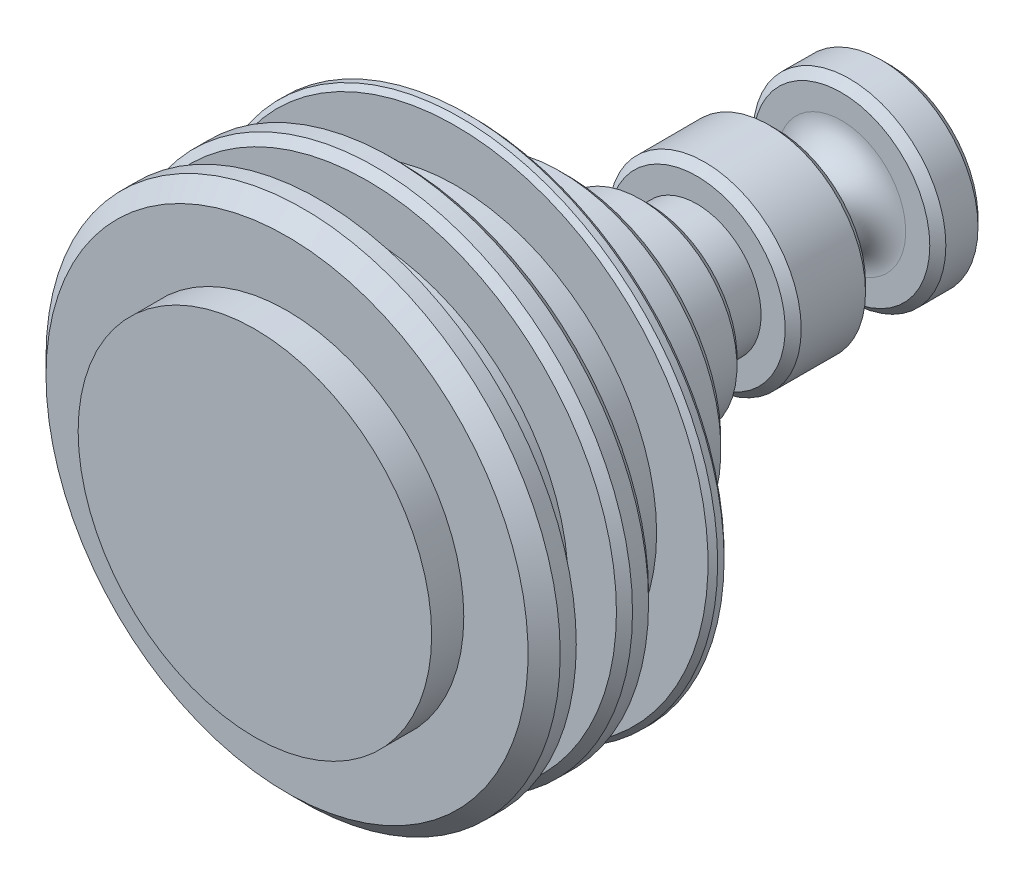
ISO-10303-21;
HEADER;
FILE_DESCRIPTION(('STEP AP214'),'2;1');
FILE_NAME('part.step','',(''),(''),'','','');
FILE_SCHEMA(('AUTOMOTIVE_DESIGN { 1 0 10303 214 1 1 1 1 }'));
ENDSEC;
DATA;
#1=APPLICATION_CONTEXT('core data for automotive mechanical design processes');
#2=APPLICATION_PROTOCOL_DEFINITION('international standard','automotive_design',2000,#1);
#3=PRODUCT_CONTEXT('',#1,'mechanical');
#4=PRODUCT('Part','Part','',(#3));
#5=PRODUCT_RELATED_PRODUCT_CATEGORY('part','',(#4));
#6=PRODUCT_DEFINITION_FORMATION('','',#4);
#7=PRODUCT_DEFINITION_CONTEXT('part definition',#1,'design');
#8=PRODUCT_DEFINITION('design','',#6,#7);
#9=PRODUCT_DEFINITION_SHAPE('','',#8);
#10=(LENGTH_UNIT() NAMED_UNIT(*) SI_UNIT(.MILLI.,.METRE.));
#11=(NAMED_UNIT(*) PLANE_ANGLE_UNIT() SI_UNIT($,.RADIAN.));
#12=(NAMED_UNIT(*) SI_UNIT($,.STERADIAN.) SOLID_ANGLE_UNIT());
#13=UNCERTAINTY_MEASURE_WITH_UNIT(LENGTH_MEASURE(1.E-05),#10,'distance_accuracy_value','');
#14=(GEOMETRIC_REPRESENTATION_CONTEXT(3) GLOBAL_UNCERTAINTY_ASSIGNED_CONTEXT((#13)) GLOBAL_UNIT_ASSIGNED_CONTEXT((#10,
#11,#12)) REPRESENTATION_CONTEXT('',''));
#15=CARTESIAN_POINT('',(0.,0.,0.));
#16=DIRECTION('',(0.,0.,1.));
#17=DIRECTION('',(1.,0.,0.));
#18=AXIS2_PLACEMENT_3D('',#15,#16,#17);
#19=CARTESIAN_POINT('',(-10.4857690202518,0.,-30.5));
#20=DIRECTION('',(0.,0.,1.));
#21=DIRECTION('',(1.,0.,0.));
#22=AXIS2_PLACEMENT_3D('',#19,#20,#21);
#23=PLANE('',#22);
#24=CARTESIAN_POINT('',(0.,0.,-30.5));
#25=DIRECTION('',(0.,0.,1.));
#26=DIRECTION('',(1.,0.,0.));
#27=AXIS2_PLACEMENT_3D('',#24,#25,#26);
#28=CIRCLE('',#27,5.5);
#29=CARTESIAN_POINT('',(5.5,0.,-30.5));
#30=VERTEX_POINT('',#29);
#31=EDGE_CURVE('E79',#30,#30,#28,.F.);
#32=ORIENTED_EDGE('',*,*,#31,.T.);
#33=EDGE_LOOP('',(#32));
#34=FACE_BOUND('',#33,.T.);
#35=CARTESIAN_POINT('',(0.,0.,-30.5));
#36=DIRECTION('',(0.,0.,-1.));
#37=DIRECTION('',(-1.,0.,0.));
#38=AXIS2_PLACEMENT_3D('',#35,#36,#37);
#39=CIRCLE('',#38,4.);
#40=CARTESIAN_POINT('',(-4.,0.,-30.5));
#41=VERTEX_POINT('',#40);
#42=EDGE_CURVE('E145',#41,#41,#39,.T.);
#43=ORIENTED_EDGE('',*,*,#42,.F.);
#44=EDGE_LOOP('',(#43));
#45=FACE_BOUND('',#44,.T.);
#46=ADVANCED_FACE('F35',(#34,#45),#23,.F.);
#47=CARTESIAN_POINT('',(-10.4857690202518,0.,-34.5));
#48=DIRECTION('',(0.,0.,1.));
#49=DIRECTION('',(1.,0.,0.));
#50=AXIS2_PLACEMENT_3D('',#47,#48,#49);
#51=PLANE('',#50);
#52=CARTESIAN_POINT('',(0.,0.,-34.5));
#53=DIRECTION('',(0.,0.,1.));
#54=DIRECTION('',(1.,0.,0.));
#55=AXIS2_PLACEMENT_3D('',#52,#53,#54);
#56=CIRCLE('',#55,5.49999999999999);
#57=CARTESIAN_POINT('',(5.49999999999999,0.,-34.5));
#58=VERTEX_POINT('',#57);
#59=EDGE_CURVE('E88',#58,#58,#56,.T.);
#60=ORIENTED_EDGE('',*,*,#59,.T.);
#61=EDGE_LOOP('',(#60));
#62=FACE_BOUND('',#61,.T.);
#63=CARTESIAN_POINT('',(0.,0.,-34.5));
#64=DIRECTION('',(0.,0.,-1.));
#65=DIRECTION('',(-1.,0.,0.));
#66=AXIS2_PLACEMENT_3D('',#63,#64,#65);
#67=CIRCLE('',#66,4.);
#68=CARTESIAN_POINT('',(-4.,0.,-34.5));
#69=VERTEX_POINT('',#68);
#70=EDGE_CURVE('E148',#69,#69,#67,.T.);
#71=ORIENTED_EDGE('',*,*,#70,.T.);
#72=EDGE_LOOP('',(#71));
#73=FACE_BOUND('',#72,.T.);
#74=ADVANCED_FACE('F152',(#62,#73),#51,.T.);
#75=CARTESIAN_POINT('',(0.,0.,-32.5));
#76=DIRECTION('',(0.,0.,-1.));
#77=DIRECTION('',(-1.,0.,0.));
#78=AXIS2_PLACEMENT_3D('',#75,#76,#77);
#79=TOROIDAL_SURFACE('',#78,4.,2.);
#80=ORIENTED_EDGE('',*,*,#42,.T.);
#81=EDGE_LOOP('',(#80));
#82=FACE_BOUND('',#81,.T.);
#83=ORIENTED_EDGE('',*,*,#70,.F.);
#84=EDGE_LOOP('',(#83));
#85=FACE_BOUND('',#84,.T.);
#86=ADVANCED_FACE('F154',(#82,#85),#79,.F.);
#87=CARTESIAN_POINT('',(0.,0.,-37.5));
#88=DIRECTION('',(0.,0.,-1.));
#89=DIRECTION('',(-1.,0.,0.));
#90=AXIS2_PLACEMENT_3D('',#87,#88,#89);
#91=PLANE('',#90);
#92=CARTESIAN_POINT('',(0.,0.,-37.5));
#93=DIRECTION('',(0.,0.,-1.));
#94=DIRECTION('',(-1.,0.,0.));
#95=AXIS2_PLACEMENT_3D('',#92,#93,#94);
#96=CIRCLE('',#95,5.49999999999999);
#97=CARTESIAN_POINT('',(-5.49999999999999,0.,-37.5));
#98=VERTEX_POINT('',#97);
#99=EDGE_CURVE('E97',#98,#98,#96,.T.);
#100=ORIENTED_EDGE('',*,*,#99,.T.);
#101=EDGE_LOOP('',(#100));
#102=FACE_BOUND('',#101,.T.);
#103=ADVANCED_FACE('F156',(#102),#91,.T.);
#104=CARTESIAN_POINT('',(0.,0.,-37.5));
#105=DIRECTION('',(0.,0.,1.));
#106=DIRECTION('',(1.,0.,0.));
#107=AXIS2_PLACEMENT_3D('',#104,#105,#106);
#108=CYLINDRICAL_SURFACE('',#107,6.);
#109=CARTESIAN_POINT('',(0.,0.,-37.));
#110=DIRECTION('',(0.,0.,-1.));
#111=DIRECTION('',(-1.,0.,0.));
#112=AXIS2_PLACEMENT_3D('',#109,#110,#111);
#113=CIRCLE('',#112,6.);
#114=CARTESIAN_POINT('',(-6.,0.,-37.));
#115=VERTEX_POINT('',#114);
#116=EDGE_CURVE('E91',#115,#115,#113,.F.);
#117=ORIENTED_EDGE('',*,*,#116,.T.);
#118=EDGE_LOOP('',(#117));
#119=FACE_BOUND('',#118,.T.);
#120=CARTESIAN_POINT('',(0.,0.,-35.));
#121=DIRECTION('',(0.,0.,1.));
#122=DIRECTION('',(1.,0.,0.));
#123=AXIS2_PLACEMENT_3D('',#120,#121,#122);
#124=CIRCLE('',#123,6.);
#125=CARTESIAN_POINT('',(6.,0.,-35.));
#126=VERTEX_POINT('',#125);
#127=EDGE_CURVE('E94',#126,#126,#124,.F.);
#128=ORIENTED_EDGE('',*,*,#127,.T.);
#129=EDGE_LOOP('',(#128));
#130=FACE_BOUND('',#129,.T.);
#131=ADVANCED_FACE('F163',(#119,#130),#108,.T.);
#132=CARTESIAN_POINT('',(0.,0.,-25.5));
#133=DIRECTION('',(0.,0.,-1.));
#134=DIRECTION('',(-1.,0.,0.));
#135=AXIS2_PLACEMENT_3D('',#132,#133,#134);
#136=PLANE('',#135);
#137=CARTESIAN_POINT('',(0.,0.,-25.5));
#138=DIRECTION('',(0.,0.,-1.));
#139=DIRECTION('',(-1.,0.,0.));
#140=AXIS2_PLACEMENT_3D('',#137,#138,#139);
#141=CIRCLE('',#140,5.5);
#142=CARTESIAN_POINT('',(-5.5,0.,-25.5));
#143=VERTEX_POINT('',#142);
#144=EDGE_CURVE('E76',#143,#143,#141,.F.);
#145=ORIENTED_EDGE('',*,*,#144,.T.);
#146=EDGE_LOOP('',(#145));
#147=FACE_BOUND('',#146,.T.);
#148=CARTESIAN_POINT('',(0.,0.,-25.5));
#149=DIRECTION('',(0.,0.,-1.));
#150=DIRECTION('',(-1.,0.,0.));
#151=AXIS2_PLACEMENT_3D('',#148,#149,#150);
#152=CIRCLE('',#151,4.);
#153=CARTESIAN_POINT('',(-4.,0.,-25.5));
#154=VERTEX_POINT('',#153);
#155=EDGE_CURVE('E139',#154,#154,#152,.T.);
#156=ORIENTED_EDGE('',*,*,#155,.T.);
#157=EDGE_LOOP('',(#156));
#158=FACE_BOUND('',#157,.T.);
#159=ADVANCED_FACE('F416',(#147,#158),#136,.F.);
#160=CARTESIAN_POINT('',(0.,0.,-30.));
#161=DIRECTION('',(0.,0.,1.));
#162=DIRECTION('',(1.,0.,0.));
#163=AXIS2_PLACEMENT_3D('',#160,#161,#162);
#164=CIRCLE('',#163,6.);
#165=CARTESIAN_POINT('',(6.,0.,-30.));
#166=VERTEX_POINT('',#165);
#167=EDGE_CURVE('E82',#166,#166,#164,.T.);
#168=ORIENTED_EDGE('',*,*,#167,.T.);
#169=EDGE_LOOP('',(#168));
#170=FACE_BOUND('',#169,.T.);
#171=CARTESIAN_POINT('',(0.,0.,-26.));
#172=DIRECTION('',(0.,0.,-1.));
#173=DIRECTION('',(-1.,0.,0.));
#174=AXIS2_PLACEMENT_3D('',#171,#172,#173);
#175=CIRCLE('',#174,6.);
#176=CARTESIAN_POINT('',(-6.,0.,-26.));
#177=VERTEX_POINT('',#176);
#178=EDGE_CURVE('E85',#177,#177,#175,.T.);
#179=ORIENTED_EDGE('',*,*,#178,.T.);
#180=EDGE_LOOP('',(#179));
#181=FACE_BOUND('',#180,.T.);
#182=ADVANCED_FACE('F408',(#170,#181),#108,.T.);
#183=CARTESIAN_POINT('',(0.,0.,-22.5));
#184=DIRECTION('',(0.,0.,-1.));
#185=DIRECTION('',(-1.,0.,0.));
#186=AXIS2_PLACEMENT_3D('',#183,#184,#185);
#187=PLANE('',#186);
#188=CARTESIAN_POINT('',(0.,0.,-22.5));
#189=DIRECTION('',(0.,0.,-1.));
#190=DIRECTION('',(-1.,0.,0.));
#191=AXIS2_PLACEMENT_3D('',#188,#189,#190);
#192=CIRCLE('',#191,5.49999999999999);
#193=CARTESIAN_POINT('',(-5.49999999999999,0.,-22.5));
#194=VERTEX_POINT('',#193);
#195=EDGE_CURVE('E73',#194,#194,#192,.T.);
#196=ORIENTED_EDGE('',*,*,#195,.T.);
#197=EDGE_LOOP('',(#196));
#198=FACE_BOUND('',#197,.T.);
#199=CARTESIAN_POINT('',(0.,0.,-22.5));
#200=DIRECTION('',(0.,0.,-1.));
#201=DIRECTION('',(-1.,0.,0.));
#202=AXIS2_PLACEMENT_3D('',#199,#200,#201);
#203=CIRCLE('',#202,4.);
#204=CARTESIAN_POINT('',(-4.,0.,-22.5));
#205=VERTEX_POINT('',#204);
#206=EDGE_CURVE('E142',#205,#205,#203,.T.);
#207=ORIENTED_EDGE('',*,*,#206,.F.);
#208=EDGE_LOOP('',(#207));
#209=FACE_BOUND('',#208,.T.);
#210=ADVANCED_FACE('F400',(#198,#209),#187,.T.);
#211=CARTESIAN_POINT('',(0.,0.,-17.5));
#212=DIRECTION('',(0.,0.,-1.));
#213=DIRECTION('',(-1.,0.,0.));
#214=AXIS2_PLACEMENT_3D('',#211,#212,#213);
#215=PLANE('',#214);
#216=CARTESIAN_POINT('',(0.,0.,-17.5));
#217=DIRECTION('',(0.,0.,-1.));
#218=DIRECTION('',(-1.,0.,0.));
#219=AXIS2_PLACEMENT_3D('',#216,#217,#218);
#220=CIRCLE('',#219,9.49999999999999);
#221=CARTESIAN_POINT('',(-9.49999999999999,0.,-17.5));
#222=VERTEX_POINT('',#221);
#223=EDGE_CURVE('E67',#222,#222,#220,.T.);
#224=ORIENTED_EDGE('',*,*,#223,.T.);
#225=EDGE_LOOP('',(#224));
#226=FACE_BOUND('',#225,.T.);
#227=CARTESIAN_POINT('',(0.,0.,-17.5));
#228=DIRECTION('',(0.,0.,-1.));
#229=DIRECTION('',(-1.,0.,0.));
#230=AXIS2_PLACEMENT_3D('',#227,#228,#229);
#231=CIRCLE('',#230,6.);
#232=CARTESIAN_POINT('',(-6.,0.,-17.5));
#233=VERTEX_POINT('',#232);
#234=EDGE_CURVE('E136',#233,#233,#231,.T.);
#235=ORIENTED_EDGE('',*,*,#234,.F.);
#236=EDGE_LOOP('',(#235));
#237=FACE_BOUND('',#236,.T.);
#238=ADVANCED_FACE('F392',(#226,#237),#215,.T.);
#239=CARTESIAN_POINT('',(0.,0.,-11.5));
#240=DIRECTION('',(0.,0.,-1.));
#241=DIRECTION('',(-1.,0.,0.));
#242=AXIS2_PLACEMENT_3D('',#239,#240,#241);
#243=PLANE('',#242);
#244=CARTESIAN_POINT('',(0.,0.,-11.5));
#245=DIRECTION('',(0.,0.,-1.));
#246=DIRECTION('',(-1.,0.,0.));
#247=AXIS2_PLACEMENT_3D('',#244,#245,#246);
#248=CIRCLE('',#247,15.7);
#249=CARTESIAN_POINT('',(-15.7,0.,-11.5));
#250=VERTEX_POINT('',#249);
#251=EDGE_CURVE('E58',#250,#250,#248,.T.);
#252=ORIENTED_EDGE('',*,*,#251,.T.);
#253=EDGE_LOOP('',(#252));
#254=FACE_BOUND('',#253,.T.);
#255=CARTESIAN_POINT('',(0.,0.,-11.5));
#256=DIRECTION('',(0.,0.,-1.));
#257=DIRECTION('',(-1.,0.,0.));
#258=AXIS2_PLACEMENT_3D('',#255,#256,#257);
#259=CIRCLE('',#258,10.);
#260=CARTESIAN_POINT('',(-10.,0.,-11.5));
#261=VERTEX_POINT('',#260);
#262=EDGE_CURVE('E133',#261,#261,#259,.T.);
#263=ORIENTED_EDGE('',*,*,#262,.F.);
#264=EDGE_LOOP('',(#263));
#265=FACE_BOUND('',#264,.T.);
#266=ADVANCED_FACE('F384',(#254,#265),#243,.T.);
#267=CARTESIAN_POINT('',(0.,0.,-10.5));
#268=DIRECTION('',(0.,0.,-1.));
#269=DIRECTION('',(-1.,0.,0.));
#270=AXIS2_PLACEMENT_3D('',#267,#268,#269);
#271=PLANE('',#270);
#272=CARTESIAN_POINT('',(0.,0.,-10.5));
#273=DIRECTION('',(0.,0.,-1.));
#274=DIRECTION('',(-1.,0.,0.));
#275=AXIS2_PLACEMENT_3D('',#272,#273,#274);
#276=CIRCLE('',#275,15.7);
#277=CARTESIAN_POINT('',(-15.7,0.,-10.5));
#278=VERTEX_POINT('',#277);
#279=EDGE_CURVE('E46',#278,#278,#276,.F.);
#280=ORIENTED_EDGE('',*,*,#279,.T.);
#281=EDGE_LOOP('',(#280));
#282=FACE_BOUND('',#281,.T.);
#283=CARTESIAN_POINT('',(0.,0.,-10.5));
#284=DIRECTION('',(0.,0.,-1.));
#285=DIRECTION('',(-1.,0.,0.));
#286=AXIS2_PLACEMENT_3D('',#283,#284,#285);
#287=CIRCLE('',#286,12.5);
#288=CARTESIAN_POINT('',(-12.5,0.,-10.5));
#289=VERTEX_POINT('',#288);
#290=EDGE_CURVE('E130',#289,#289,#287,.T.);
#291=ORIENTED_EDGE('',*,*,#290,.T.);
#292=EDGE_LOOP('',(#291));
#293=FACE_BOUND('',#292,.T.);
#294=ADVANCED_FACE('F376',(#282,#293),#271,.F.);
#295=CARTESIAN_POINT('',(0.,0.,-11.5));
#296=DIRECTION('',(0.,0.,1.));
#297=DIRECTION('',(1.,0.,0.));
#298=AXIS2_PLACEMENT_3D('',#295,#296,#297);
#299=CYLINDRICAL_SURFACE('',#298,16.);
#300=CARTESIAN_POINT('',(0.,0.,-11.2));
#301=DIRECTION('',(0.,0.,-1.));
#302=DIRECTION('',(-1.,0.,0.));
#303=AXIS2_PLACEMENT_3D('',#300,#301,#302);
#304=CIRCLE('',#303,16.);
#305=CARTESIAN_POINT('',(-16.,0.,-11.2));
#306=VERTEX_POINT('',#305);
#307=EDGE_CURVE('E50',#306,#306,#304,.F.);
#308=ORIENTED_EDGE('',*,*,#307,.T.);
#309=EDGE_LOOP('',(#308));
#310=FACE_BOUND('',#309,.T.);
#311=CARTESIAN_POINT('',(0.,0.,-10.8));
#312=DIRECTION('',(0.,0.,-1.));
#313=DIRECTION('',(-1.,0.,0.));
#314=AXIS2_PLACEMENT_3D('',#311,#312,#313);
#315=CIRCLE('',#314,16.);
#316=CARTESIAN_POINT('',(-16.,0.,-10.8));
#317=VERTEX_POINT('',#316);
#318=EDGE_CURVE('E55',#317,#317,#315,.T.);
#319=ORIENTED_EDGE('',*,*,#318,.T.);
#320=EDGE_LOOP('',(#319));
#321=FACE_BOUND('',#320,.T.);
#322=ADVANCED_FACE('F368',(#310,#321),#299,.T.);
#323=CARTESIAN_POINT('',(0.,0.,-7.));
#324=DIRECTION('',(0.,0.,-1.));
#325=DIRECTION('',(-1.,0.,0.));
#326=AXIS2_PLACEMENT_3D('',#323,#324,#325);
#327=PLANE('',#326);
#328=CARTESIAN_POINT('',(0.,0.,-7.));
#329=DIRECTION('',(0.,0.,-1.));
#330=DIRECTION('',(-1.,0.,0.));
#331=AXIS2_PLACEMENT_3D('',#328,#329,#330);
#332=CIRCLE('',#331,13.);
#333=CARTESIAN_POINT('',(-13.,0.,-7.));
#334=VERTEX_POINT('',#333);
#335=EDGE_CURVE('E106',#334,#334,#332,.F.);
#336=ORIENTED_EDGE('',*,*,#335,.T.);
#337=EDGE_LOOP('',(#336));
#338=FACE_BOUND('',#337,.T.);
#339=CARTESIAN_POINT('',(0.,0.,-7.));
#340=DIRECTION('',(0.,0.,-1.));
#341=DIRECTION('',(-1.,0.,0.));
#342=AXIS2_PLACEMENT_3D('',#339,#340,#341);
#343=CIRCLE('',#342,15.5);
#344=CARTESIAN_POINT('',(-15.5,0.,-7.));
#345=VERTEX_POINT('',#344);
#346=EDGE_CURVE('E109',#345,#345,#343,.T.);
#347=ORIENTED_EDGE('',*,*,#346,.T.);
#348=EDGE_LOOP('',(#347));
#349=FACE_BOUND('',#348,.T.);
#350=ADVANCED_FACE('F360',(#338,#349),#327,.T.);
#351=CARTESIAN_POINT('',(0.,0.,-5.));
#352=DIRECTION('',(0.,0.,-1.));
#353=DIRECTION('',(-1.,0.,0.));
#354=AXIS2_PLACEMENT_3D('',#351,#352,#353);
#355=PLANE('',#354);
#356=CARTESIAN_POINT('',(0.,0.,-5.));
#357=DIRECTION('',(0.,0.,-1.));
#358=DIRECTION('',(-1.,0.,0.));
#359=AXIS2_PLACEMENT_3D('',#356,#357,#358);
#360=CIRCLE('',#359,15.5);
#361=CARTESIAN_POINT('',(-15.5,0.,-5.));
#362=VERTEX_POINT('',#361);
#363=EDGE_CURVE('E61',#362,#362,#360,.F.);
#364=ORIENTED_EDGE('',*,*,#363,.T.);
#365=EDGE_LOOP('',(#364));
#366=FACE_BOUND('',#365,.T.);
#367=CARTESIAN_POINT('',(0.,0.,-5.));
#368=DIRECTION('',(0.,0.,-1.));
#369=DIRECTION('',(-1.,0.,0.));
#370=AXIS2_PLACEMENT_3D('',#367,#368,#369);
#371=CIRCLE('',#370,12.5);
#372=CARTESIAN_POINT('',(-12.5,0.,-5.));
#373=VERTEX_POINT('',#372);
#374=EDGE_CURVE('E124',#373,#373,#371,.T.);
#375=ORIENTED_EDGE('',*,*,#374,.T.);
#376=EDGE_LOOP('',(#375));
#377=FACE_BOUND('',#376,.T.);
#378=ADVANCED_FACE('F352',(#366,#377),#355,.F.);
#379=CARTESIAN_POINT('',(0.,0.,-7.));
#380=DIRECTION('',(0.,0.,1.));
#381=DIRECTION('',(1.,0.,0.));
#382=AXIS2_PLACEMENT_3D('',#379,#380,#381);
#383=CYLINDRICAL_SURFACE('',#382,16.);
#384=CARTESIAN_POINT('',(0.,0.,-6.5));
#385=DIRECTION('',(0.,0.,-1.));
#386=DIRECTION('',(-1.,0.,0.));
#387=AXIS2_PLACEMENT_3D('',#384,#385,#386);
#388=CIRCLE('',#387,16.);
#389=CARTESIAN_POINT('',(-16.,0.,-6.5));
#390=VERTEX_POINT('',#389);
#391=EDGE_CURVE('E100',#390,#390,#388,.F.);
#392=ORIENTED_EDGE('',*,*,#391,.T.);
#393=EDGE_LOOP('',(#392));
#394=FACE_BOUND('',#393,.T.);
#395=CARTESIAN_POINT('',(0.,0.,-5.50000000000001));
#396=DIRECTION('',(0.,0.,-1.));
#397=DIRECTION('',(-1.,0.,0.));
#398=AXIS2_PLACEMENT_3D('',#395,#396,#397);
#399=CIRCLE('',#398,16.);
#400=CARTESIAN_POINT('',(-16.,0.,-5.50000000000001));
#401=VERTEX_POINT('',#400);
#402=EDGE_CURVE('E103',#401,#401,#399,.T.);
#403=ORIENTED_EDGE('',*,*,#402,.T.);
#404=EDGE_LOOP('',(#403));
#405=FACE_BOUND('',#404,.T.);
#406=ADVANCED_FACE('F344',(#394,#405),#383,.T.);
#407=CARTESIAN_POINT('',(0.,0.,-2.));
#408=DIRECTION('',(0.,0.,-1.));
#409=DIRECTION('',(-1.,0.,0.));
#410=AXIS2_PLACEMENT_3D('',#407,#408,#409);
#411=PLANE('',#410);
#412=CARTESIAN_POINT('',(0.,0.,-2.));
#413=DIRECTION('',(0.,0.,-1.));
#414=DIRECTION('',(-1.,0.,0.));
#415=AXIS2_PLACEMENT_3D('',#412,#413,#414);
#416=CIRCLE('',#415,16.);
#417=CARTESIAN_POINT('',(-16.,0.,-2.));
#418=VERTEX_POINT('',#417);
#419=EDGE_CURVE('E121',#418,#418,#416,.T.);
#420=ORIENTED_EDGE('',*,*,#419,.T.);
#421=EDGE_LOOP('',(#420));
#422=FACE_BOUND('',#421,.T.);
#423=CARTESIAN_POINT('',(0.,0.,-2.));
#424=DIRECTION('',(0.,0.,-1.));
#425=DIRECTION('',(-1.,0.,0.));
#426=AXIS2_PLACEMENT_3D('',#423,#424,#425);
#427=CIRCLE('',#426,12.5);
#428=CARTESIAN_POINT('',(-12.5,0.,-2.));
#429=VERTEX_POINT('',#428);
#430=EDGE_CURVE('E127',#429,#429,#427,.T.);
#431=ORIENTED_EDGE('',*,*,#430,.F.);
#432=EDGE_LOOP('',(#431));
#433=FACE_BOUND('',#432,.T.);
#434=ADVANCED_FACE('F332',(#422,#433),#411,.T.);
#435=CARTESIAN_POINT('',(0.,0.,2.));
#436=DIRECTION('',(0.,0.,-1.));
#437=DIRECTION('',(-1.,0.,0.));
#438=AXIS2_PLACEMENT_3D('',#435,#436,#437);
#439=CYLINDRICAL_SURFACE('',#438,11.);
#440=CARTESIAN_POINT('',(0.,0.,2.));
#441=DIRECTION('',(0.,0.,1.));
#442=DIRECTION('',(1.,0.,0.));
#443=AXIS2_PLACEMENT_3D('',#440,#441,#442);
#444=CIRCLE('',#443,11.);
#445=CARTESIAN_POINT('',(11.,0.,2.));
#446=VERTEX_POINT('',#445);
#447=EDGE_CURVE('E115',#446,#446,#444,.T.);
#448=ORIENTED_EDGE('',*,*,#447,.F.);
#449=EDGE_LOOP('',(#448));
#450=FACE_BOUND('',#449,.T.);
#451=CARTESIAN_POINT('',(0.,0.,0.));
#452=DIRECTION('',(0.,0.,-1.));
#453=DIRECTION('',(-1.,0.,0.));
#454=AXIS2_PLACEMENT_3D('',#451,#452,#453);
#455=CIRCLE('',#454,11.);
#456=CARTESIAN_POINT('',(-11.,0.,0.));
#457=VERTEX_POINT('',#456);
#458=EDGE_CURVE('E118',#457,#457,#455,.T.);
#459=ORIENTED_EDGE('',*,*,#458,.F.);
#460=EDGE_LOOP('',(#459));
#461=FACE_BOUND('',#460,.T.);
#462=ADVANCED_FACE('F37',(#450,#461),#439,.T.);
#463=CARTESIAN_POINT('',(0.,0.,2.));
#464=DIRECTION('',(0.,0.,1.));
#465=DIRECTION('',(1.,0.,0.));
#466=AXIS2_PLACEMENT_3D('',#463,#464,#465);
#467=PLANE('',#466);
#468=ORIENTED_EDGE('',*,*,#447,.T.);
#469=EDGE_LOOP('',(#468));
#470=FACE_BOUND('',#469,.T.);
#471=ADVANCED_FACE('F324',(#470),#467,.T.);
#472=CARTESIAN_POINT('',(0.,0.,0.));
#473=DIRECTION('',(0.,0.,-1.));
#474=DIRECTION('',(-1.,0.,0.));
#475=AXIS2_PLACEMENT_3D('',#472,#473,#474);
#476=PLANE('',#475);
#477=CARTESIAN_POINT('',(0.,0.,0.));
#478=DIRECTION('',(0.,0.,-1.));
#479=DIRECTION('',(-1.,0.,0.));
#480=AXIS2_PLACEMENT_3D('',#477,#478,#479);
#481=CIRCLE('',#480,15.);
#482=CARTESIAN_POINT('',(-15.,0.,0.));
#483=VERTEX_POINT('',#482);
#484=EDGE_CURVE('E10',#483,#483,#481,.F.);
#485=ORIENTED_EDGE('',*,*,#484,.T.);
#486=EDGE_LOOP('',(#485));
#487=FACE_BOUND('',#486,.T.);
#488=ORIENTED_EDGE('',*,*,#458,.T.);
#489=EDGE_LOOP('',(#488));
#490=FACE_BOUND('',#489,.T.);
#491=ADVANCED_FACE('F317',(#487,#490),#476,.F.);
#492=CARTESIAN_POINT('',(0.,0.,-2.));
#493=DIRECTION('',(0.,0.,1.));
#494=DIRECTION('',(1.,0.,0.));
#495=AXIS2_PLACEMENT_3D('',#492,#493,#494);
#496=CYLINDRICAL_SURFACE('',#495,16.);
#497=CARTESIAN_POINT('',(0.,0.,-1.00000000000002));
#498=DIRECTION('',(0.,0.,-1.));
#499=DIRECTION('',(-1.,0.,0.));
#500=AXIS2_PLACEMENT_3D('',#497,#498,#499);
#501=CIRCLE('',#500,16.);
#502=CARTESIAN_POINT('',(-16.,0.,-1.00000000000002));
#503=VERTEX_POINT('',#502);
#504=EDGE_CURVE('E42',#503,#503,#501,.T.);
#505=ORIENTED_EDGE('',*,*,#504,.T.);
#506=EDGE_LOOP('',(#505));
#507=FACE_BOUND('',#506,.T.);
#508=ORIENTED_EDGE('',*,*,#419,.F.);
#509=EDGE_LOOP('',(#508));
#510=FACE_BOUND('',#509,.T.);
#511=ADVANCED_FACE('F309',(#507,#510),#496,.T.);
#512=CARTESIAN_POINT('',(0.,0.,-5.));
#513=DIRECTION('',(0.,0.,1.));
#514=DIRECTION('',(1.,0.,0.));
#515=AXIS2_PLACEMENT_3D('',#512,#513,#514);
#516=CYLINDRICAL_SURFACE('',#515,12.5);
#517=ORIENTED_EDGE('',*,*,#374,.F.);
#518=EDGE_LOOP('',(#517));
#519=FACE_BOUND('',#518,.T.);
#520=ORIENTED_EDGE('',*,*,#430,.T.);
#521=EDGE_LOOP('',(#520));
#522=FACE_BOUND('',#521,.T.);
#523=ADVANCED_FACE('F301',(#519,#522),#516,.T.);
#524=CARTESIAN_POINT('',(0.,0.,-10.5));
#525=DIRECTION('',(0.,0.,1.));
#526=DIRECTION('',(1.,0.,0.));
#527=AXIS2_PLACEMENT_3D('',#524,#525,#526);
#528=CYLINDRICAL_SURFACE('',#527,12.5);
#529=CARTESIAN_POINT('',(0.,0.,-7.50000000000001));
#530=DIRECTION('',(0.,0.,-1.));
#531=DIRECTION('',(-1.,0.,0.));
#532=AXIS2_PLACEMENT_3D('',#529,#530,#531);
#533=CIRCLE('',#532,12.5);
#534=CARTESIAN_POINT('',(-12.5,0.,-7.50000000000001));
#535=VERTEX_POINT('',#534);
#536=EDGE_CURVE('E112',#535,#535,#533,.T.);
#537=ORIENTED_EDGE('',*,*,#536,.T.);
#538=EDGE_LOOP('',(#537));
#539=FACE_BOUND('',#538,.T.);
#540=ORIENTED_EDGE('',*,*,#290,.F.);
#541=EDGE_LOOP('',(#540));
#542=FACE_BOUND('',#541,.T.);
#543=ADVANCED_FACE('F293',(#539,#542),#528,.T.);
#544=CARTESIAN_POINT('',(0.,0.,-17.5));
#545=DIRECTION('',(0.,0.,1.));
#546=DIRECTION('',(1.,0.,0.));
#547=AXIS2_PLACEMENT_3D('',#544,#545,#546);
#548=CYLINDRICAL_SURFACE('',#547,10.);
#549=CARTESIAN_POINT('',(0.,0.,-17.));
#550=DIRECTION('',(0.,0.,-1.));
#551=DIRECTION('',(-1.,0.,0.));
#552=AXIS2_PLACEMENT_3D('',#549,#550,#551);
#553=CIRCLE('',#552,10.);
#554=CARTESIAN_POINT('',(-10.,0.,-17.));
#555=VERTEX_POINT('',#554);
#556=EDGE_CURVE('E64',#555,#555,#553,.F.);
#557=ORIENTED_EDGE('',*,*,#556,.T.);
#558=EDGE_LOOP('',(#557));
#559=FACE_BOUND('',#558,.T.);
#560=ORIENTED_EDGE('',*,*,#262,.T.);
#561=EDGE_LOOP('',(#560));
#562=FACE_BOUND('',#561,.T.);
#563=ADVANCED_FACE('F285',(#559,#562),#548,.T.);
#564=CARTESIAN_POINT('',(0.,0.,-22.5));
#565=DIRECTION('',(0.,0.,1.));
#566=DIRECTION('',(1.,0.,0.));
#567=AXIS2_PLACEMENT_3D('',#564,#565,#566);
#568=CYLINDRICAL_SURFACE('',#567,6.);
#569=CARTESIAN_POINT('',(0.,0.,-22.));
#570=DIRECTION('',(0.,0.,-1.));
#571=DIRECTION('',(-1.,0.,0.));
#572=AXIS2_PLACEMENT_3D('',#569,#570,#571);
#573=CIRCLE('',#572,6.);
#574=CARTESIAN_POINT('',(-6.,0.,-22.));
#575=VERTEX_POINT('',#574);
#576=EDGE_CURVE('E70',#575,#575,#573,.F.);
#577=ORIENTED_EDGE('',*,*,#576,.T.);
#578=EDGE_LOOP('',(#577));
#579=FACE_BOUND('',#578,.T.);
#580=ORIENTED_EDGE('',*,*,#234,.T.);
#581=EDGE_LOOP('',(#580));
#582=FACE_BOUND('',#581,.T.);
#583=ADVANCED_FACE('F277',(#579,#582),#568,.T.);
#584=CARTESIAN_POINT('',(0.,0.,-25.5));
#585=DIRECTION('',(0.,0.,1.));
#586=DIRECTION('',(1.,0.,0.));
#587=AXIS2_PLACEMENT_3D('',#584,#585,#586);
#588=CYLINDRICAL_SURFACE('',#587,4.);
#589=ORIENTED_EDGE('',*,*,#155,.F.);
#590=EDGE_LOOP('',(#589));
#591=FACE_BOUND('',#590,.T.);
#592=ORIENTED_EDGE('',*,*,#206,.T.);
#593=EDGE_LOOP('',(#592));
#594=FACE_BOUND('',#593,.T.);
#595=ADVANCED_FACE('F180',(#591,#594),#588,.T.);
#596=CARTESIAN_POINT('',(0.,0.,-7.50000000000001));
#597=DIRECTION('',(0.,0.,1.));
#598=DIRECTION('',(1.,0.,0.));
#599=AXIS2_PLACEMENT_3D('',#596,#597,#598);
#600=CONICAL_SURFACE('',#599,12.5,0.785398163397443);
#601=ORIENTED_EDGE('',*,*,#335,.F.);
#602=EDGE_LOOP('',(#601));
#603=FACE_BOUND('',#602,.T.);
#604=ORIENTED_EDGE('',*,*,#536,.F.);
#605=EDGE_LOOP('',(#604));
#606=FACE_BOUND('',#605,.T.);
#607=ADVANCED_FACE('F176',(#603,#606),#600,.T.);
#608=CARTESIAN_POINT('',(0.,0.,-7.));
#609=DIRECTION('',(0.,0.,1.));
#610=DIRECTION('',(1.,0.,0.));
#611=AXIS2_PLACEMENT_3D('',#608,#609,#610);
#612=CONICAL_SURFACE('',#611,15.5,0.785398163397453);
#613=ORIENTED_EDGE('',*,*,#391,.F.);
#614=EDGE_LOOP('',(#613));
#615=FACE_BOUND('',#614,.T.);
#616=ORIENTED_EDGE('',*,*,#346,.F.);
#617=EDGE_LOOP('',(#616));
#618=FACE_BOUND('',#617,.T.);
#619=ADVANCED_FACE('F179',(#615,#618),#612,.T.);
#620=CARTESIAN_POINT('',(0.,0.,-37.5));
#621=DIRECTION('',(0.,0.,1.));
#622=DIRECTION('',(1.,0.,0.));
#623=AXIS2_PLACEMENT_3D('',#620,#621,#622);
#624=CONICAL_SURFACE('',#623,5.49999999999999,0.785398163397457);
#625=ORIENTED_EDGE('',*,*,#116,.F.);
#626=EDGE_LOOP('',(#625));
#627=FACE_BOUND('',#626,.T.);
#628=ORIENTED_EDGE('',*,*,#99,.F.);
#629=EDGE_LOOP('',(#628));
#630=FACE_BOUND('',#629,.T.);
#631=ADVANCED_FACE('F184',(#627,#630),#624,.T.);
#632=CARTESIAN_POINT('',(0.,0.,-34.5));
#633=DIRECTION('',(0.,0.,-1.));
#634=DIRECTION('',(-1.,0.,0.));
#635=AXIS2_PLACEMENT_3D('',#632,#633,#634);
#636=CONICAL_SURFACE('',#635,5.49999999999999,0.785398163397457);
#637=ORIENTED_EDGE('',*,*,#127,.F.);
#638=EDGE_LOOP('',(#637));
#639=FACE_BOUND('',#638,.T.);
#640=ORIENTED_EDGE('',*,*,#59,.F.);
#641=EDGE_LOOP('',(#640));
#642=FACE_BOUND('',#641,.T.);
#643=ADVANCED_FACE('F188',(#639,#642),#636,.T.);
#644=CARTESIAN_POINT('',(0.,0.,-30.));
#645=DIRECTION('',(0.,0.,1.));
#646=DIRECTION('',(1.,0.,0.));
#647=AXIS2_PLACEMENT_3D('',#644,#645,#646);
#648=CONICAL_SURFACE('',#647,6.,0.785398163397445);
#649=ORIENTED_EDGE('',*,*,#31,.F.);
#650=EDGE_LOOP('',(#649));
#651=FACE_BOUND('',#650,.T.);
#652=ORIENTED_EDGE('',*,*,#167,.F.);
#653=EDGE_LOOP('',(#652));
#654=FACE_BOUND('',#653,.T.);
#655=ADVANCED_FACE('F192',(#651,#654),#648,.T.);
#656=CARTESIAN_POINT('',(0.,0.,-26.));
#657=DIRECTION('',(0.,0.,-1.));
#658=DIRECTION('',(-1.,0.,0.));
#659=AXIS2_PLACEMENT_3D('',#656,#657,#658);
#660=CONICAL_SURFACE('',#659,6.,0.785398163397445);
#661=ORIENTED_EDGE('',*,*,#144,.F.);
#662=EDGE_LOOP('',(#661));
#663=FACE_BOUND('',#662,.T.);
#664=ORIENTED_EDGE('',*,*,#178,.F.);
#665=EDGE_LOOP('',(#664));
#666=FACE_BOUND('',#665,.T.);
#667=ADVANCED_FACE('F196',(#663,#666),#660,.T.);
#668=CARTESIAN_POINT('',(0.,0.,-22.5));
#669=DIRECTION('',(0.,0.,1.));
#670=DIRECTION('',(1.,0.,0.));
#671=AXIS2_PLACEMENT_3D('',#668,#669,#670);
#672=CONICAL_SURFACE('',#671,5.49999999999999,0.785398163397453);
#673=ORIENTED_EDGE('',*,*,#576,.F.);
#674=EDGE_LOOP('',(#673));
#675=FACE_BOUND('',#674,.T.);
#676=ORIENTED_EDGE('',*,*,#195,.F.);
#677=EDGE_LOOP('',(#676));
#678=FACE_BOUND('',#677,.T.);
#679=ADVANCED_FACE('F200',(#675,#678),#672,.T.);
#680=CARTESIAN_POINT('',(0.,0.,-17.5));
#681=DIRECTION('',(0.,0.,1.));
#682=DIRECTION('',(1.,0.,0.));
#683=AXIS2_PLACEMENT_3D('',#680,#681,#682);
#684=CONICAL_SURFACE('',#683,9.49999999999999,0.785398163397453);
#685=ORIENTED_EDGE('',*,*,#556,.F.);
#686=EDGE_LOOP('',(#685));
#687=FACE_BOUND('',#686,.T.);
#688=ORIENTED_EDGE('',*,*,#223,.F.);
#689=EDGE_LOOP('',(#688));
#690=FACE_BOUND('',#689,.T.);
#691=ADVANCED_FACE('F204',(#687,#690),#684,.T.);
#692=CARTESIAN_POINT('',(0.,0.,-5.50000000000001));
#693=DIRECTION('',(0.,0.,-1.));
#694=DIRECTION('',(-1.,0.,0.));
#695=AXIS2_PLACEMENT_3D('',#692,#693,#694);
#696=CONICAL_SURFACE('',#695,16.,0.785398163397443);
#697=ORIENTED_EDGE('',*,*,#363,.F.);
#698=EDGE_LOOP('',(#697));
#699=FACE_BOUND('',#698,.T.);
#700=ORIENTED_EDGE('',*,*,#402,.F.);
#701=EDGE_LOOP('',(#700));
#702=FACE_BOUND('',#701,.T.);
#703=ADVANCED_FACE('F208',(#699,#702),#696,.T.);
#704=CARTESIAN_POINT('',(0.,0.,-11.5));
#705=DIRECTION('',(0.,0.,1.));
#706=DIRECTION('',(1.,0.,0.));
#707=AXIS2_PLACEMENT_3D('',#704,#705,#706);
#708=CONICAL_SURFACE('',#707,15.7,0.785398163397454);
#709=ORIENTED_EDGE('',*,*,#307,.F.);
#710=EDGE_LOOP('',(#709));
#711=FACE_BOUND('',#710,.T.);
#712=ORIENTED_EDGE('',*,*,#251,.F.);
#713=EDGE_LOOP('',(#712));
#714=FACE_BOUND('',#713,.T.);
#715=ADVANCED_FACE('F212',(#711,#714),#708,.T.);
#716=CARTESIAN_POINT('',(0.,0.,-10.8));
#717=DIRECTION('',(0.,0.,-1.));
#718=DIRECTION('',(-1.,0.,0.));
#719=AXIS2_PLACEMENT_3D('',#716,#717,#718);
#720=CONICAL_SURFACE('',#719,16.,0.785398163397443);
#721=CARTESIAN_POINT('',(-15.7,0.,-10.5));
#722=CARTESIAN_POINT('',(-15.703125,0.,-10.503125));
#723=CARTESIAN_POINT('',(-15.70625,0.,-10.50625));
#724=CARTESIAN_POINT('',(-15.7125,0.,-10.5125));
#725=CARTESIAN_POINT('',(-15.715625,0.,-10.515625));
#726=CARTESIAN_POINT('',(-15.721875,0.,-10.521875));
#727=CARTESIAN_POINT('',(-15.725,0.,-10.525));
#728=CARTESIAN_POINT('',(-15.73125,0.,-10.53125));
#729=CARTESIAN_POINT('',(-15.734375,0.,-10.534375));
#730=CARTESIAN_POINT('',(-15.740625,0.,-10.540625));
#731=CARTESIAN_POINT('',(-15.74375,0.,-10.54375));
#732=CARTESIAN_POINT('',(-15.75,0.,-10.55));
#733=CARTESIAN_POINT('',(-15.753125,0.,-10.553125));
#734=CARTESIAN_POINT('',(-15.759375,0.,-10.559375));
#735=CARTESIAN_POINT('',(-15.7625,0.,-10.5625));
#736=CARTESIAN_POINT('',(-15.76875,0.,-10.56875));
#737=CARTESIAN_POINT('',(-15.771875,0.,-10.571875));
#738=CARTESIAN_POINT('',(-15.778125,0.,-10.578125));
#739=CARTESIAN_POINT('',(-15.78125,0.,-10.58125));
#740=CARTESIAN_POINT('',(-15.7875,0.,-10.5875));
#741=CARTESIAN_POINT('',(-15.790625,0.,-10.590625));
#742=CARTESIAN_POINT('',(-15.796875,0.,-10.596875));
#743=CARTESIAN_POINT('',(-15.8,0.,-10.6));
#744=CARTESIAN_POINT('',(-15.80625,0.,-10.60625));
#745=CARTESIAN_POINT('',(-15.809375,0.,-10.609375));
#746=CARTESIAN_POINT('',(-15.815625,0.,-10.615625));
#747=CARTESIAN_POINT('',(-15.81875,0.,-10.61875));
#748=CARTESIAN_POINT('',(-15.825,0.,-10.625));
#749=CARTESIAN_POINT('',(-15.828125,0.,-10.628125));
#750=CARTESIAN_POINT('',(-15.834375,0.,-10.634375));
#751=CARTESIAN_POINT('',(-15.8375,0.,-10.6375));
#752=CARTESIAN_POINT('',(-15.84375,0.,-10.64375));
#753=CARTESIAN_POINT('',(-15.846875,0.,-10.646875));
#754=CARTESIAN_POINT('',(-15.853125,0.,-10.653125));
#755=CARTESIAN_POINT('',(-15.85625,0.,-10.65625));
#756=CARTESIAN_POINT('',(-15.8625,0.,-10.6625));
#757=CARTESIAN_POINT('',(-15.865625,0.,-10.665625));
#758=CARTESIAN_POINT('',(-15.871875,0.,-10.671875));
#759=CARTESIAN_POINT('',(-15.875,0.,-10.675));
#760=CARTESIAN_POINT('',(-15.88125,0.,-10.68125));
#761=CARTESIAN_POINT('',(-15.884375,0.,-10.684375));
#762=CARTESIAN_POINT('',(-15.890625,0.,-10.690625));
#763=CARTESIAN_POINT('',(-15.89375,0.,-10.69375));
#764=CARTESIAN_POINT('',(-15.9,0.,-10.7));
#765=CARTESIAN_POINT('',(-15.903125,0.,-10.703125));
#766=CARTESIAN_POINT('',(-15.909375,0.,-10.709375));
#767=CARTESIAN_POINT('',(-15.9125,0.,-10.7125));
#768=CARTESIAN_POINT('',(-15.91875,0.,-10.71875));
#769=CARTESIAN_POINT('',(-15.921875,0.,-10.721875));
#770=CARTESIAN_POINT('',(-15.928125,0.,-10.728125));
#771=CARTESIAN_POINT('',(-15.93125,0.,-10.73125));
#772=CARTESIAN_POINT('',(-15.9375,0.,-10.7375));
#773=CARTESIAN_POINT('',(-15.940625,0.,-10.740625));
#774=CARTESIAN_POINT('',(-15.946875,0.,-10.746875));
#775=CARTESIAN_POINT('',(-15.95,0.,-10.75));
#776=CARTESIAN_POINT('',(-15.95625,0.,-10.75625));
#777=CARTESIAN_POINT('',(-15.959375,0.,-10.759375));
#778=CARTESIAN_POINT('',(-15.965625,0.,-10.765625));
#779=CARTESIAN_POINT('',(-15.96875,0.,-10.76875));
#780=CARTESIAN_POINT('',(-15.975,0.,-10.775));
#781=CARTESIAN_POINT('',(-15.978125,0.,-10.778125));
#782=CARTESIAN_POINT('',(-15.984375,0.,-10.784375));
#783=CARTESIAN_POINT('',(-15.9875,0.,-10.7875));
#784=CARTESIAN_POINT('',(-15.99375,0.,-10.79375));
#785=CARTESIAN_POINT('',(-15.996875,0.,-10.796875));
#786=CARTESIAN_POINT('',(-16.,0.,-10.8));
#787=B_SPLINE_CURVE_WITH_KNOTS('',3,(#721,#722,#723,#724,#725,#726,#727,#728,#729,#730,#731,
#732,#733,#734,#735,#736,#737,#738,#739,#740,#741,#742,#743,#744,#745,#746,#747,#748,#749,#750,
#751,#752,#753,#754,#755,#756,#757,#758,#759,#760,#761,#762,#763,#764,#765,#766,#767,#768,#769,
#770,#771,#772,#773,#774,#775,#776,#777,#778,#779,#780,#781,#782,#783,#784,#785,#786),
.UNSPECIFIED.,.F.,.F.,(4,2,2,2,2,2,2,2,2,2,2,2,2,2,2,2,2,2,2,2,2,2,2,2,2,2,2,2,2,2,2,2,4),(0.,
0.0132582521472463,0.0265165042944938,0.0397747564417438,0.0530330085889901,0.0662912607362377,
0.0795495128834876,0.092807765030734,0.106066017177981,0.119324269325231,0.132582521472478,
0.145840773619725,0.159099025766975,0.172357277914222,0.185615530061469,0.198873782208717,
0.212132034355967,0.225390286503213,0.23864853865046,0.25190679079771,0.265165042944957,
0.278423295092204,0.291681547239454,0.304939799386701,0.318198051533948,0.331456303681198,
0.344714555828444,0.357972807975692,0.371231060122942,0.384489312270188,0.397747564417436,
0.411005816564683,0.424264068711933),.UNSPECIFIED.);
#788=EDGE_CURVE('BSEAM216',#278,#317,#787,.T.);
#789=ORIENTED_EDGE('',*,*,#279,.F.);
#790=ORIENTED_EDGE('',*,*,#318,.F.);
#791=ORIENTED_EDGE('',*,*,#788,.T.);
#792=ORIENTED_EDGE('',*,*,#788,.F.);
#793=EDGE_LOOP('',(#789,#791,#790,#792));
#794=FACE_BOUND('',#793,.T.);
#795=ADVANCED_FACE('F216',(#794),#720,.T.);
#796=CARTESIAN_POINT('',(0.,0.,-1.00000000000002));
#797=DIRECTION('',(0.,0.,-1.));
#798=DIRECTION('',(-1.,0.,0.));
#799=AXIS2_PLACEMENT_3D('',#796,#797,#798);
#800=CONICAL_SURFACE('',#799,16.,0.785398163397443);
#801=ORIENTED_EDGE('',*,*,#484,.F.);
#802=EDGE_LOOP('',(#801));
#803=FACE_BOUND('',#802,.T.);
#804=ORIENTED_EDGE('',*,*,#504,.F.);
#805=EDGE_LOOP('',(#804));
#806=FACE_BOUND('',#805,.T.);
#807=ADVANCED_FACE('F220',(#803,#806),#800,.T.);
#808=CLOSED_SHELL('',(#46,#74,#86,#103,#131,#159,#182,#210,#238,#266,#294,#322,#350,#378,#406,
#434,#462,#471,#491,#511,#523,#543,#563,#583,#595,#607,#619,#631,#643,#655,#667,#679,#691,#703,
#715,#795,#807));
#809=MANIFOLD_SOLID_BREP('B2',#808);
#810=ADVANCED_BREP_SHAPE_REPRESENTATION('',(#18,#809),#14);
#811=SHAPE_DEFINITION_REPRESENTATION(#9,#810);
ENDSEC;
END-ISO-10303-21;
